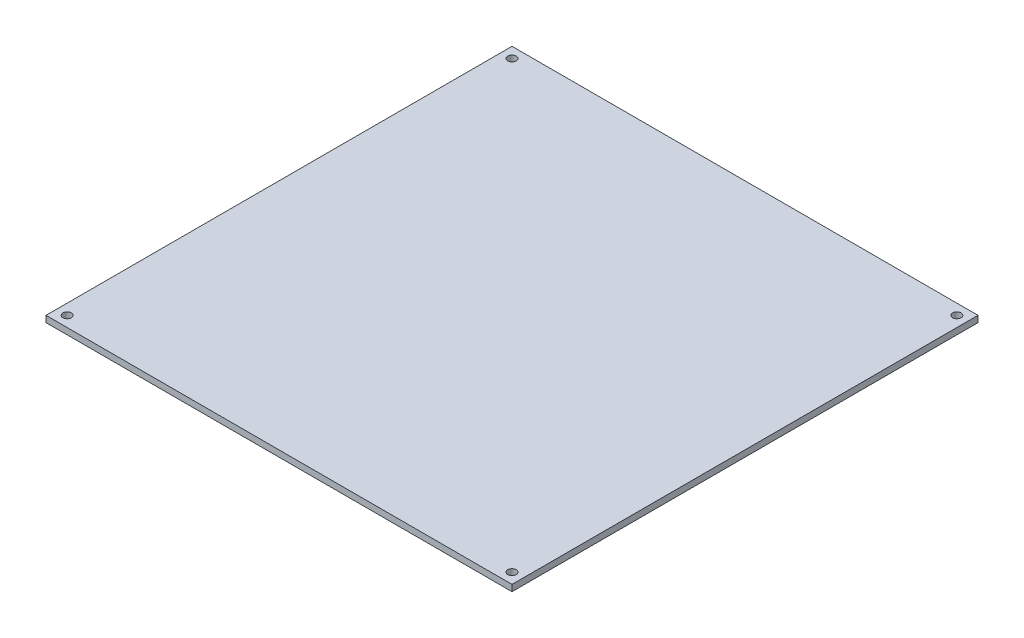
ISO-10303-21;
HEADER;
FILE_DESCRIPTION(('STEP AP214'),'2;1');
FILE_NAME('part.step','',(''),(''),'','','');
FILE_SCHEMA(('AUTOMOTIVE_DESIGN { 1 0 10303 214 1 1 1 1 }'));
ENDSEC;
DATA;
#1=APPLICATION_CONTEXT('core data for automotive mechanical design processes');
#2=APPLICATION_PROTOCOL_DEFINITION('international standard','automotive_design',2000,#1);
#3=PRODUCT_CONTEXT('',#1,'mechanical');
#4=PRODUCT('Part','Part','',(#3));
#5=PRODUCT_RELATED_PRODUCT_CATEGORY('part','',(#4));
#6=PRODUCT_DEFINITION_FORMATION('','',#4);
#7=PRODUCT_DEFINITION_CONTEXT('part definition',#1,'design');
#8=PRODUCT_DEFINITION('design','',#6,#7);
#9=PRODUCT_DEFINITION_SHAPE('','',#8);
#10=(LENGTH_UNIT() NAMED_UNIT(*) SI_UNIT(.MILLI.,.METRE.));
#11=(NAMED_UNIT(*) PLANE_ANGLE_UNIT() SI_UNIT($,.RADIAN.));
#12=(NAMED_UNIT(*) SI_UNIT($,.STERADIAN.) SOLID_ANGLE_UNIT());
#13=UNCERTAINTY_MEASURE_WITH_UNIT(LENGTH_MEASURE(1.E-05),#10,'distance_accuracy_value','');
#14=(GEOMETRIC_REPRESENTATION_CONTEXT(3) GLOBAL_UNCERTAINTY_ASSIGNED_CONTEXT((#13)) GLOBAL_UNIT_ASSIGNED_CONTEXT((#10,
#11,#12)) REPRESENTATION_CONTEXT('',''));
#15=CARTESIAN_POINT('',(0.,0.,0.));
#16=DIRECTION('',(0.,0.,1.));
#17=DIRECTION('',(1.,0.,0.));
#18=AXIS2_PLACEMENT_3D('',#15,#16,#17);
#19=CARTESIAN_POINT('',(0.,3.,0.));
#20=DIRECTION('',(0.,1.,0.));
#21=DIRECTION('',(0.,0.,1.));
#22=AXIS2_PLACEMENT_3D('',#19,#20,#21);
#23=PLANE('',#22);
#24=CARTESIAN_POINT('',(-104.999999999994,3.,105.000000000006));
#25=DIRECTION('',(0.,1.,0.));
#26=DIRECTION('',(0.,0.,1.));
#27=AXIS2_PLACEMENT_3D('',#24,#25,#26);
#28=CIRCLE('',#27,2.00000000000432);
#29=CARTESIAN_POINT('',(-104.999999999994,3.,107.00000000001));
#30=VERTEX_POINT('',#29);
#31=EDGE_CURVE('E146',#30,#30,#28,.T.);
#32=ORIENTED_EDGE('',*,*,#31,.F.);
#33=EDGE_LOOP('',(#32));
#34=FACE_BOUND('',#33,.T.);
#35=CARTESIAN_POINT('',(105.,3.,-105.));
#36=DIRECTION('',(0.,1.,0.));
#37=DIRECTION('',(0.,0.,1.));
#38=AXIS2_PLACEMENT_3D('',#35,#36,#37);
#39=CIRCLE('',#38,2.);
#40=CARTESIAN_POINT('',(105.,3.,-103.));
#41=VERTEX_POINT('',#40);
#42=EDGE_CURVE('E116',#41,#41,#39,.T.);
#43=ORIENTED_EDGE('',*,*,#42,.F.);
#44=EDGE_LOOP('',(#43));
#45=FACE_BOUND('',#44,.T.);
#46=DIRECTION('',(0.,0.,-1.));
#47=VECTOR('',#46,1.);
#48=CARTESIAN_POINT('',(110.,3.,-110.));
#49=LINE('',#48,#47);
#50=CARTESIAN_POINT('',(110.,3.,110.));
#51=VERTEX_POINT('',#50);
#52=CARTESIAN_POINT('',(110.,3.,-110.));
#53=VERTEX_POINT('',#52);
#54=EDGE_CURVE('E96',#51,#53,#49,.T.);
#55=ORIENTED_EDGE('',*,*,#54,.T.);
#56=DIRECTION('',(-1.,0.,0.));
#57=VECTOR('',#56,1.);
#58=CARTESIAN_POINT('',(-110.,3.,-110.));
#59=LINE('',#58,#57);
#60=CARTESIAN_POINT('',(-110.,3.,-110.));
#61=VERTEX_POINT('',#60);
#62=EDGE_CURVE('E91',#53,#61,#59,.T.);
#63=ORIENTED_EDGE('',*,*,#62,.T.);
#64=DIRECTION('',(0.,0.,1.));
#65=VECTOR('',#64,1.);
#66=CARTESIAN_POINT('',(-110.,3.,-110.));
#67=LINE('',#66,#65);
#68=CARTESIAN_POINT('',(-110.,3.,110.));
#69=VERTEX_POINT('',#68);
#70=EDGE_CURVE('E94',#61,#69,#67,.T.);
#71=ORIENTED_EDGE('',*,*,#70,.T.);
#72=DIRECTION('',(1.,0.,0.));
#73=VECTOR('',#72,1.);
#74=CARTESIAN_POINT('',(-110.,3.,110.));
#75=LINE('',#74,#73);
#76=EDGE_CURVE('E61',#69,#51,#75,.T.);
#77=ORIENTED_EDGE('',*,*,#76,.T.);
#78=EDGE_LOOP('',(#55,#63,#71,#77));
#79=FACE_BOUND('',#78,.T.);
#80=CARTESIAN_POINT('',(105.000000000006,3.,105.));
#81=DIRECTION('',(0.,1.,0.));
#82=DIRECTION('',(0.,0.,1.));
#83=AXIS2_PLACEMENT_3D('',#80,#81,#82);
#84=CIRCLE('',#83,1.99999999999854);
#85=CARTESIAN_POINT('',(105.000000000006,3.,106.999999999999));
#86=VERTEX_POINT('',#85);
#87=EDGE_CURVE('E138',#86,#86,#84,.T.);
#88=ORIENTED_EDGE('',*,*,#87,.F.);
#89=EDGE_LOOP('',(#88));
#90=FACE_BOUND('',#89,.T.);
#91=CARTESIAN_POINT('',(-105.,3.,-104.999999999994));
#92=DIRECTION('',(0.,1.,0.));
#93=DIRECTION('',(0.,0.,1.));
#94=AXIS2_PLACEMENT_3D('',#91,#92,#93);
#95=CIRCLE('',#94,2.00000000000629);
#96=CARTESIAN_POINT('',(-105.,3.,-102.999999999988));
#97=VERTEX_POINT('',#96);
#98=EDGE_CURVE('E154',#97,#97,#95,.T.);
#99=ORIENTED_EDGE('',*,*,#98,.F.);
#100=EDGE_LOOP('',(#99));
#101=FACE_BOUND('',#100,.T.);
#102=ADVANCED_FACE('F43',(#34,#45,#79,#90,#101),#23,.T.);
#103=CARTESIAN_POINT('',(0.,0.,0.));
#104=DIRECTION('',(0.,1.,0.));
#105=DIRECTION('',(0.,0.,1.));
#106=AXIS2_PLACEMENT_3D('',#103,#104,#105);
#107=PLANE('',#106);
#108=DIRECTION('',(0.,0.,-1.));
#109=VECTOR('',#108,1.);
#110=CARTESIAN_POINT('',(110.,0.,-110.));
#111=LINE('',#110,#109);
#112=CARTESIAN_POINT('',(110.,0.,110.));
#113=VERTEX_POINT('',#112);
#114=CARTESIAN_POINT('',(110.,0.,-110.));
#115=VERTEX_POINT('',#114);
#116=EDGE_CURVE('E112',#113,#115,#111,.T.);
#117=ORIENTED_EDGE('',*,*,#116,.F.);
#118=DIRECTION('',(1.,0.,0.));
#119=VECTOR('',#118,1.);
#120=CARTESIAN_POINT('',(-110.,0.,110.));
#121=LINE('',#120,#119);
#122=CARTESIAN_POINT('',(-110.,0.,110.));
#123=VERTEX_POINT('',#122);
#124=EDGE_CURVE('E84',#123,#113,#121,.T.);
#125=ORIENTED_EDGE('',*,*,#124,.F.);
#126=DIRECTION('',(0.,0.,1.));
#127=VECTOR('',#126,1.);
#128=CARTESIAN_POINT('',(-110.,0.,-110.));
#129=LINE('',#128,#127);
#130=CARTESIAN_POINT('',(-110.,0.,-110.));
#131=VERTEX_POINT('',#130);
#132=EDGE_CURVE('E78',#131,#123,#129,.T.);
#133=ORIENTED_EDGE('',*,*,#132,.F.);
#134=DIRECTION('',(-1.,0.,0.));
#135=VECTOR('',#134,1.);
#136=CARTESIAN_POINT('',(-110.,0.,-110.));
#137=LINE('',#136,#135);
#138=EDGE_CURVE('E101',#115,#131,#137,.T.);
#139=ORIENTED_EDGE('',*,*,#138,.F.);
#140=EDGE_LOOP('',(#117,#125,#133,#139));
#141=FACE_BOUND('',#140,.T.);
#142=CARTESIAN_POINT('',(105.,0.,-105.));
#143=DIRECTION('',(0.,1.,0.));
#144=DIRECTION('',(0.,0.,1.));
#145=AXIS2_PLACEMENT_3D('',#142,#143,#144);
#146=CIRCLE('',#145,2.);
#147=CARTESIAN_POINT('',(105.,0.,-103.));
#148=VERTEX_POINT('',#147);
#149=EDGE_CURVE('E134',#148,#148,#146,.T.);
#150=ORIENTED_EDGE('',*,*,#149,.T.);
#151=EDGE_LOOP('',(#150));
#152=FACE_BOUND('',#151,.T.);
#153=CARTESIAN_POINT('',(105.000000000006,0.,105.));
#154=DIRECTION('',(0.,1.,0.));
#155=DIRECTION('',(0.,0.,1.));
#156=AXIS2_PLACEMENT_3D('',#153,#154,#155);
#157=CIRCLE('',#156,1.99999999999854);
#158=CARTESIAN_POINT('',(105.000000000006,0.,106.999999999999));
#159=VERTEX_POINT('',#158);
#160=EDGE_CURVE('E142',#159,#159,#157,.T.);
#161=ORIENTED_EDGE('',*,*,#160,.T.);
#162=EDGE_LOOP('',(#161));
#163=FACE_BOUND('',#162,.T.);
#164=CARTESIAN_POINT('',(-104.999999999994,0.,105.000000000006));
#165=DIRECTION('',(0.,1.,0.));
#166=DIRECTION('',(0.,0.,1.));
#167=AXIS2_PLACEMENT_3D('',#164,#165,#166);
#168=CIRCLE('',#167,2.00000000000432);
#169=CARTESIAN_POINT('',(-104.999999999994,0.,107.00000000001));
#170=VERTEX_POINT('',#169);
#171=EDGE_CURVE('E150',#170,#170,#168,.T.);
#172=ORIENTED_EDGE('',*,*,#171,.T.);
#173=EDGE_LOOP('',(#172));
#174=FACE_BOUND('',#173,.T.);
#175=CARTESIAN_POINT('',(-105.,0.,-104.999999999994));
#176=DIRECTION('',(0.,1.,0.));
#177=DIRECTION('',(0.,0.,1.));
#178=AXIS2_PLACEMENT_3D('',#175,#176,#177);
#179=CIRCLE('',#178,2.00000000000629);
#180=CARTESIAN_POINT('',(-105.,0.,-102.999999999988));
#181=VERTEX_POINT('',#180);
#182=EDGE_CURVE('E158',#181,#181,#179,.T.);
#183=ORIENTED_EDGE('',*,*,#182,.T.);
#184=EDGE_LOOP('',(#183));
#185=FACE_BOUND('',#184,.T.);
#186=ADVANCED_FACE('F129',(#141,#152,#163,#174,#185),#107,.F.);
#187=CARTESIAN_POINT('',(110.,3.,-110.));
#188=DIRECTION('',(-1.,0.,0.));
#189=DIRECTION('',(0.,0.,1.));
#190=AXIS2_PLACEMENT_3D('',#187,#188,#189);
#191=PLANE('',#190);
#192=ORIENTED_EDGE('',*,*,#116,.T.);
#193=DIRECTION('',(0.,-1.,0.));
#194=VECTOR('',#193,1.);
#195=CARTESIAN_POINT('',(110.,3.,-110.));
#196=LINE('',#195,#194);
#197=EDGE_CURVE('E11',#53,#115,#196,.T.);
#198=ORIENTED_EDGE('',*,*,#197,.F.);
#199=ORIENTED_EDGE('',*,*,#54,.F.);
#200=DIRECTION('',(0.,-1.,0.));
#201=VECTOR('',#200,1.);
#202=CARTESIAN_POINT('',(110.,3.,110.));
#203=LINE('',#202,#201);
#204=EDGE_CURVE('E108',#51,#113,#203,.T.);
#205=ORIENTED_EDGE('',*,*,#204,.T.);
#206=EDGE_LOOP('',(#192,#198,#199,#205));
#207=FACE_BOUND('',#206,.T.);
#208=ADVANCED_FACE('F45',(#207),#191,.F.);
#209=CARTESIAN_POINT('',(-110.,3.,-110.));
#210=DIRECTION('',(0.,0.,1.));
#211=DIRECTION('',(1.,0.,0.));
#212=AXIS2_PLACEMENT_3D('',#209,#210,#211);
#213=PLANE('',#212);
#214=ORIENTED_EDGE('',*,*,#138,.T.);
#215=DIRECTION('',(0.,-1.,0.));
#216=VECTOR('',#215,1.);
#217=CARTESIAN_POINT('',(-110.,3.,-110.));
#218=LINE('',#217,#216);
#219=EDGE_CURVE('E53',#61,#131,#218,.T.);
#220=ORIENTED_EDGE('',*,*,#219,.F.);
#221=ORIENTED_EDGE('',*,*,#62,.F.);
#222=ORIENTED_EDGE('',*,*,#197,.T.);
#223=EDGE_LOOP('',(#214,#220,#221,#222));
#224=FACE_BOUND('',#223,.T.);
#225=ADVANCED_FACE('F100',(#224),#213,.F.);
#226=CARTESIAN_POINT('',(-110.,3.,-110.));
#227=DIRECTION('',(1.,0.,0.));
#228=DIRECTION('',(0.,0.,-1.));
#229=AXIS2_PLACEMENT_3D('',#226,#227,#228);
#230=PLANE('',#229);
#231=ORIENTED_EDGE('',*,*,#132,.T.);
#232=DIRECTION('',(0.,-1.,0.));
#233=VECTOR('',#232,1.);
#234=CARTESIAN_POINT('',(-110.,3.,110.));
#235=LINE('',#234,#233);
#236=EDGE_CURVE('E103',#69,#123,#235,.T.);
#237=ORIENTED_EDGE('',*,*,#236,.F.);
#238=ORIENTED_EDGE('',*,*,#70,.F.);
#239=ORIENTED_EDGE('',*,*,#219,.T.);
#240=EDGE_LOOP('',(#231,#237,#238,#239));
#241=FACE_BOUND('',#240,.T.);
#242=ADVANCED_FACE('F104',(#241),#230,.F.);
#243=CARTESIAN_POINT('',(-110.,3.,110.));
#244=DIRECTION('',(0.,0.,-1.));
#245=DIRECTION('',(-1.,0.,0.));
#246=AXIS2_PLACEMENT_3D('',#243,#244,#245);
#247=PLANE('',#246);
#248=ORIENTED_EDGE('',*,*,#124,.T.);
#249=ORIENTED_EDGE('',*,*,#204,.F.);
#250=ORIENTED_EDGE('',*,*,#76,.F.);
#251=ORIENTED_EDGE('',*,*,#236,.T.);
#252=EDGE_LOOP('',(#248,#249,#250,#251));
#253=FACE_BOUND('',#252,.T.);
#254=ADVANCED_FACE('F126',(#253),#247,.F.);
#255=CARTESIAN_POINT('',(105.,3.,-105.));
#256=DIRECTION('',(0.,-1.,0.));
#257=DIRECTION('',(0.,0.,-1.));
#258=AXIS2_PLACEMENT_3D('',#255,#256,#257);
#259=CYLINDRICAL_SURFACE('',#258,2.);
#260=ORIENTED_EDGE('',*,*,#42,.T.);
#261=EDGE_LOOP('',(#260));
#262=FACE_BOUND('',#261,.T.);
#263=ORIENTED_EDGE('',*,*,#149,.F.);
#264=EDGE_LOOP('',(#263));
#265=FACE_BOUND('',#264,.T.);
#266=ADVANCED_FACE('F179',(#262,#265),#259,.F.);
#267=CARTESIAN_POINT('',(105.000000000006,3.,105.));
#268=DIRECTION('',(0.,-1.,0.));
#269=DIRECTION('',(0.,0.,-1.));
#270=AXIS2_PLACEMENT_3D('',#267,#268,#269);
#271=CYLINDRICAL_SURFACE('',#270,1.99999999999854);
#272=ORIENTED_EDGE('',*,*,#87,.T.);
#273=EDGE_LOOP('',(#272));
#274=FACE_BOUND('',#273,.T.);
#275=ORIENTED_EDGE('',*,*,#160,.F.);
#276=EDGE_LOOP('',(#275));
#277=FACE_BOUND('',#276,.T.);
#278=ADVANCED_FACE('F217',(#274,#277),#271,.F.);
#279=CARTESIAN_POINT('',(-104.999999999994,3.,105.000000000006));
#280=DIRECTION('',(0.,-1.,0.));
#281=DIRECTION('',(0.,0.,-1.));
#282=AXIS2_PLACEMENT_3D('',#279,#280,#281);
#283=CYLINDRICAL_SURFACE('',#282,2.00000000000432);
#284=ORIENTED_EDGE('',*,*,#31,.T.);
#285=EDGE_LOOP('',(#284));
#286=FACE_BOUND('',#285,.T.);
#287=ORIENTED_EDGE('',*,*,#171,.F.);
#288=EDGE_LOOP('',(#287));
#289=FACE_BOUND('',#288,.T.);
#290=ADVANCED_FACE('F206',(#286,#289),#283,.F.);
#291=CARTESIAN_POINT('',(-105.,3.,-104.999999999994));
#292=DIRECTION('',(0.,-1.,0.));
#293=DIRECTION('',(0.,0.,-1.));
#294=AXIS2_PLACEMENT_3D('',#291,#292,#293);
#295=CYLINDRICAL_SURFACE('',#294,2.00000000000629);
#296=ORIENTED_EDGE('',*,*,#98,.T.);
#297=EDGE_LOOP('',(#296));
#298=FACE_BOUND('',#297,.T.);
#299=ORIENTED_EDGE('',*,*,#182,.F.);
#300=EDGE_LOOP('',(#299));
#301=FACE_BOUND('',#300,.T.);
#302=ADVANCED_FACE('F166',(#298,#301),#295,.F.);
#303=CLOSED_SHELL('',(#102,#186,#208,#225,#242,#254,#266,#278,#290,#302));
#304=MANIFOLD_SOLID_BREP('B2',#303);
#305=ADVANCED_BREP_SHAPE_REPRESENTATION('',(#18,#304),#14);
#306=SHAPE_DEFINITION_REPRESENTATION(#9,#305);
ENDSEC;
END-ISO-10303-21;
